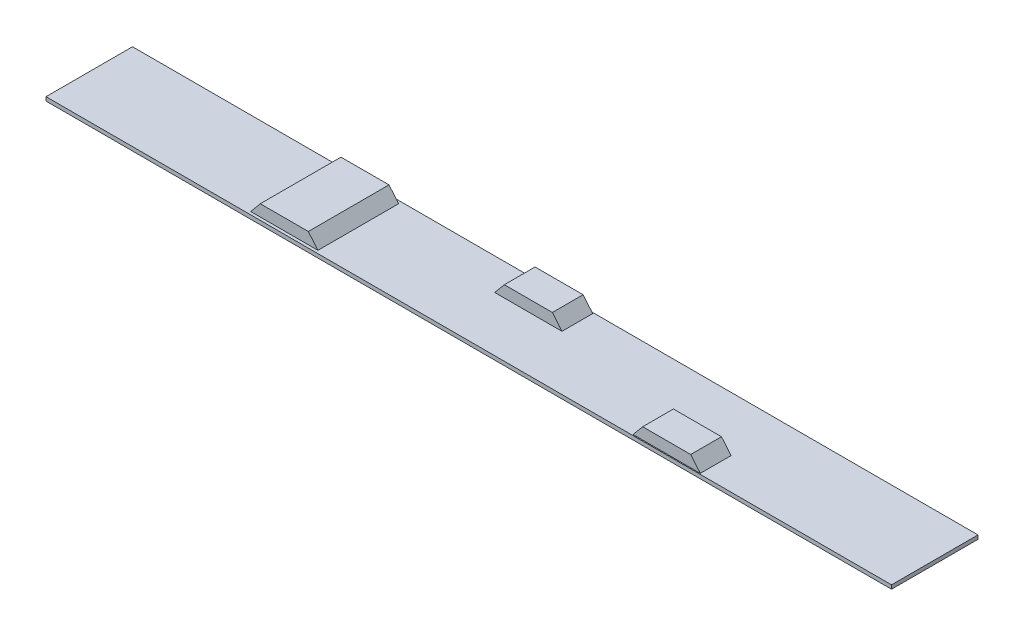
ISO-10303-21;
HEADER;
FILE_DESCRIPTION(('STEP AP214'),'2;1');
FILE_NAME('part.step','',(''),(''),'','','');
FILE_SCHEMA(('AUTOMOTIVE_DESIGN { 1 0 10303 214 1 1 1 1 }'));
ENDSEC;
DATA;
#1=APPLICATION_CONTEXT('core data for automotive mechanical design processes');
#2=APPLICATION_PROTOCOL_DEFINITION('international standard','automotive_design',2000,#1);
#3=PRODUCT_CONTEXT('',#1,'mechanical');
#4=PRODUCT('Part','Part','',(#3));
#5=PRODUCT_RELATED_PRODUCT_CATEGORY('part','',(#4));
#6=PRODUCT_DEFINITION_FORMATION('','',#4);
#7=PRODUCT_DEFINITION_CONTEXT('part definition',#1,'design');
#8=PRODUCT_DEFINITION('design','',#6,#7);
#9=PRODUCT_DEFINITION_SHAPE('','',#8);
#10=(LENGTH_UNIT() NAMED_UNIT(*) SI_UNIT(.MILLI.,.METRE.));
#11=(NAMED_UNIT(*) PLANE_ANGLE_UNIT() SI_UNIT($,.RADIAN.));
#12=(NAMED_UNIT(*) SI_UNIT($,.STERADIAN.) SOLID_ANGLE_UNIT());
#13=UNCERTAINTY_MEASURE_WITH_UNIT(LENGTH_MEASURE(1.E-05),#10,'distance_accuracy_value','');
#14=(GEOMETRIC_REPRESENTATION_CONTEXT(3) GLOBAL_UNCERTAINTY_ASSIGNED_CONTEXT((#13)) GLOBAL_UNIT_ASSIGNED_CONTEXT((#10,
#11,#12)) REPRESENTATION_CONTEXT('',''));
#15=CARTESIAN_POINT('',(0.,0.,0.));
#16=DIRECTION('',(0.,0.,1.));
#17=DIRECTION('',(1.,0.,0.));
#18=AXIS2_PLACEMENT_3D('',#15,#16,#17);
#19=CARTESIAN_POINT('',(0.,10.,0.));
#20=DIRECTION('',(0.,1.,0.));
#21=DIRECTION('',(0.,0.,1.));
#22=AXIS2_PLACEMENT_3D('',#19,#20,#21);
#23=PLANE('',#22);
#24=DIRECTION('',(1.,0.,0.));
#25=VECTOR('',#24,1.);
#26=CARTESIAN_POINT('',(-575.,9.99999999999302,105.));
#27=LINE('',#26,#25);
#28=CARTESIAN_POINT('',(-575.,9.99999999999302,105.));
#29=VERTEX_POINT('',#28);
#30=CARTESIAN_POINT('',(-400.,9.99999999999302,105.));
#31=VERTEX_POINT('',#30);
#32=EDGE_CURVE('E176',#29,#31,#27,.T.);
#33=ORIENTED_EDGE('',*,*,#32,.F.);
#34=DIRECTION('',(0.,0.,-1.));
#35=VECTOR('',#34,1.);
#36=CARTESIAN_POINT('',(-575.,9.99999999999302,105.));
#37=LINE('',#36,#35);
#38=CARTESIAN_POINT('',(-575.,9.99999999999302,-105.));
#39=VERTEX_POINT('',#38);
#40=EDGE_CURVE('E189',#29,#39,#37,.T.);
#41=ORIENTED_EDGE('',*,*,#40,.T.);
#42=DIRECTION('',(1.,0.,0.));
#43=VECTOR('',#42,1.);
#44=CARTESIAN_POINT('',(-575.,9.99999999999302,-105.));
#45=LINE('',#44,#43);
#46=CARTESIAN_POINT('',(-400.,10.,-105.));
#47=VERTEX_POINT('',#46);
#48=EDGE_CURVE('E180',#39,#47,#45,.T.);
#49=ORIENTED_EDGE('',*,*,#48,.T.);
#50=DIRECTION('',(0.,0.,-1.));
#51=VECTOR('',#50,1.);
#52=CARTESIAN_POINT('',(-400.,9.99999999999302,105.));
#53=LINE('',#52,#51);
#54=EDGE_CURVE('E572',#31,#47,#53,.T.);
#55=ORIENTED_EDGE('',*,*,#54,.F.);
#56=EDGE_LOOP('',(#33,#41,#49,#55));
#57=FACE_BOUND('',#56,.T.);
#58=DIRECTION('',(1.,0.,0.));
#59=VECTOR('',#58,1.);
#60=CARTESIAN_POINT('',(-74.9999999999997,9.99999999999651,-110.));
#61=LINE('',#60,#59);
#62=CARTESIAN_POINT('',(-74.9999999999997,9.99999999999651,-110.));
#63=VERTEX_POINT('',#62);
#64=CARTESIAN_POINT('',(100.,9.99999999999651,-110.));
#65=VERTEX_POINT('',#64);
#66=EDGE_CURVE('E197',#63,#65,#61,.T.);
#67=ORIENTED_EDGE('',*,*,#66,.T.);
#68=DIRECTION('',(0.,0.,1.));
#69=VECTOR('',#68,1.);
#70=CARTESIAN_POINT('',(100.,9.99999999999651,-110.));
#71=LINE('',#70,#69);
#72=CARTESIAN_POINT('',(100.,9.99999999999651,-30.));
#73=VERTEX_POINT('',#72);
#74=EDGE_CURVE('E226',#65,#73,#71,.T.);
#75=ORIENTED_EDGE('',*,*,#74,.T.);
#76=DIRECTION('',(1.,0.,0.));
#77=VECTOR('',#76,1.);
#78=CARTESIAN_POINT('',(-74.9999999999997,9.99999999999651,-30.));
#79=LINE('',#78,#77);
#80=CARTESIAN_POINT('',(-74.9999999999997,10.,-30.));
#81=VERTEX_POINT('',#80);
#82=EDGE_CURVE('E187',#81,#73,#79,.T.);
#83=ORIENTED_EDGE('',*,*,#82,.F.);
#84=DIRECTION('',(0.,0.,1.));
#85=VECTOR('',#84,1.);
#86=CARTESIAN_POINT('',(-74.9999999999997,9.99999999999651,-110.));
#87=LINE('',#86,#85);
#88=EDGE_CURVE('E209',#63,#81,#87,.T.);
#89=ORIENTED_EDGE('',*,*,#88,.F.);
#90=EDGE_LOOP('',(#67,#75,#83,#89));
#91=FACE_BOUND('',#90,.T.);
#92=DIRECTION('',(0.,0.,-1.));
#93=VECTOR('',#92,1.);
#94=CARTESIAN_POINT('',(1100.,10.,-112.5));
#95=LINE('',#94,#93);
#96=CARTESIAN_POINT('',(1100.,10.,112.5));
#97=VERTEX_POINT('',#96);
#98=CARTESIAN_POINT('',(1100.,10.,-112.5));
#99=VERTEX_POINT('',#98);
#100=EDGE_CURVE('E274',#97,#99,#95,.T.);
#101=ORIENTED_EDGE('',*,*,#100,.T.);
#102=DIRECTION('',(-1.,0.,0.));
#103=VECTOR('',#102,1.);
#104=CARTESIAN_POINT('',(-1100.,10.,-112.5));
#105=LINE('',#104,#103);
#106=CARTESIAN_POINT('',(-1100.,10.,-112.5));
#107=VERTEX_POINT('',#106);
#108=EDGE_CURVE('E278',#99,#107,#105,.T.);
#109=ORIENTED_EDGE('',*,*,#108,.T.);
#110=DIRECTION('',(0.,0.,1.));
#111=VECTOR('',#110,1.);
#112=CARTESIAN_POINT('',(-1100.,10.,-112.5));
#113=LINE('',#112,#111);
#114=CARTESIAN_POINT('',(-1100.,10.,112.5));
#115=VERTEX_POINT('',#114);
#116=EDGE_CURVE('E282',#107,#115,#113,.T.);
#117=ORIENTED_EDGE('',*,*,#116,.T.);
#118=DIRECTION('',(1.,0.,0.));
#119=VECTOR('',#118,1.);
#120=CARTESIAN_POINT('',(-1100.,10.,112.5));
#121=LINE('',#120,#119);
#122=EDGE_CURVE('E285',#115,#97,#121,.T.);
#123=ORIENTED_EDGE('',*,*,#122,.T.);
#124=EDGE_LOOP('',(#101,#109,#117,#123));
#125=FACE_BOUND('',#124,.T.);
#126=DIRECTION('',(0.,0.,-1.));
#127=VECTOR('',#126,1.);
#128=CARTESIAN_POINT('',(600.,10.,110.));
#129=LINE('',#128,#127);
#130=CARTESIAN_POINT('',(600.,10.,110.));
#131=VERTEX_POINT('',#130);
#132=CARTESIAN_POINT('',(600.,10.,30.));
#133=VERTEX_POINT('',#132);
#134=EDGE_CURVE('E269',#131,#133,#129,.T.);
#135=ORIENTED_EDGE('',*,*,#134,.F.);
#136=DIRECTION('',(1.,0.,0.));
#137=VECTOR('',#136,1.);
#138=CARTESIAN_POINT('',(425.,10.,110.));
#139=LINE('',#138,#137);
#140=CARTESIAN_POINT('',(425.,10.,110.));
#141=VERTEX_POINT('',#140);
#142=EDGE_CURVE('E232',#141,#131,#139,.T.);
#143=ORIENTED_EDGE('',*,*,#142,.F.);
#144=DIRECTION('',(0.,0.,-1.));
#145=VECTOR('',#144,1.);
#146=CARTESIAN_POINT('',(425.,10.,110.));
#147=LINE('',#146,#145);
#148=CARTESIAN_POINT('',(425.,10.,30.));
#149=VERTEX_POINT('',#148);
#150=EDGE_CURVE('E247',#141,#149,#147,.T.);
#151=ORIENTED_EDGE('',*,*,#150,.T.);
#152=DIRECTION('',(1.,0.,0.));
#153=VECTOR('',#152,1.);
#154=CARTESIAN_POINT('',(425.,10.,30.));
#155=LINE('',#154,#153);
#156=EDGE_CURVE('E222',#149,#133,#155,.T.);
#157=ORIENTED_EDGE('',*,*,#156,.T.);
#158=EDGE_LOOP('',(#135,#143,#151,#157));
#159=FACE_BOUND('',#158,.T.);
#160=ADVANCED_FACE('F43',(#57,#91,#125,#159),#23,.T.);
#161=CARTESIAN_POINT('',(1100.,10.,-112.5));
#162=DIRECTION('',(-1.,0.,0.));
#163=DIRECTION('',(0.,0.,1.));
#164=AXIS2_PLACEMENT_3D('',#161,#162,#163);
#165=PLANE('',#164);
#166=DIRECTION('',(0.,0.,-1.));
#167=VECTOR('',#166,1.);
#168=CARTESIAN_POINT('',(1100.,0.,-112.5));
#169=LINE('',#168,#167);
#170=CARTESIAN_POINT('',(1100.,0.,112.5));
#171=VERTEX_POINT('',#170);
#172=CARTESIAN_POINT('',(1100.,0.,-112.5));
#173=VERTEX_POINT('',#172);
#174=EDGE_CURVE('E273',#171,#173,#169,.T.);
#175=ORIENTED_EDGE('',*,*,#174,.T.);
#176=DIRECTION('',(0.,-1.,0.));
#177=VECTOR('',#176,1.);
#178=CARTESIAN_POINT('',(1100.,10.,-112.5));
#179=LINE('',#178,#177);
#180=EDGE_CURVE('E11',#99,#173,#179,.T.);
#181=ORIENTED_EDGE('',*,*,#180,.F.);
#182=ORIENTED_EDGE('',*,*,#100,.F.);
#183=DIRECTION('',(0.,-1.,0.));
#184=VECTOR('',#183,1.);
#185=CARTESIAN_POINT('',(1100.,10.,112.5));
#186=LINE('',#185,#184);
#187=EDGE_CURVE('E288',#97,#171,#186,.T.);
#188=ORIENTED_EDGE('',*,*,#187,.T.);
#189=EDGE_LOOP('',(#175,#181,#182,#188));
#190=FACE_BOUND('',#189,.T.);
#191=ADVANCED_FACE('F45',(#190),#165,.F.);
#192=CARTESIAN_POINT('',(-1100.,10.,-112.5));
#193=DIRECTION('',(0.,0.,1.));
#194=DIRECTION('',(1.,0.,0.));
#195=AXIS2_PLACEMENT_3D('',#192,#193,#194);
#196=PLANE('',#195);
#197=DIRECTION('',(-1.,0.,0.));
#198=VECTOR('',#197,1.);
#199=CARTESIAN_POINT('',(-1100.,0.,-112.5));
#200=LINE('',#199,#198);
#201=CARTESIAN_POINT('',(-1100.,0.,-112.5));
#202=VERTEX_POINT('',#201);
#203=EDGE_CURVE('E292',#173,#202,#200,.T.);
#204=ORIENTED_EDGE('',*,*,#203,.T.);
#205=DIRECTION('',(0.,-1.,0.));
#206=VECTOR('',#205,1.);
#207=CARTESIAN_POINT('',(-1100.,10.,-112.5));
#208=LINE('',#207,#206);
#209=EDGE_CURVE('E52',#107,#202,#208,.T.);
#210=ORIENTED_EDGE('',*,*,#209,.F.);
#211=ORIENTED_EDGE('',*,*,#108,.F.);
#212=ORIENTED_EDGE('',*,*,#180,.T.);
#213=EDGE_LOOP('',(#204,#210,#211,#212));
#214=FACE_BOUND('',#213,.T.);
#215=ADVANCED_FACE('F328',(#214),#196,.F.);
#216=CARTESIAN_POINT('',(-1100.,10.,-112.5));
#217=DIRECTION('',(1.,0.,0.));
#218=DIRECTION('',(0.,0.,-1.));
#219=AXIS2_PLACEMENT_3D('',#216,#217,#218);
#220=PLANE('',#219);
#221=DIRECTION('',(0.,0.,1.));
#222=VECTOR('',#221,1.);
#223=CARTESIAN_POINT('',(-1100.,0.,-112.5));
#224=LINE('',#223,#222);
#225=CARTESIAN_POINT('',(-1100.,0.,112.5));
#226=VERTEX_POINT('',#225);
#227=EDGE_CURVE('E295',#202,#226,#224,.T.);
#228=ORIENTED_EDGE('',*,*,#227,.T.);
#229=DIRECTION('',(0.,-1.,0.));
#230=VECTOR('',#229,1.);
#231=CARTESIAN_POINT('',(-1100.,10.,112.5));
#232=LINE('',#231,#230);
#233=EDGE_CURVE('E303',#115,#226,#232,.T.);
#234=ORIENTED_EDGE('',*,*,#233,.F.);
#235=ORIENTED_EDGE('',*,*,#116,.F.);
#236=ORIENTED_EDGE('',*,*,#209,.T.);
#237=EDGE_LOOP('',(#228,#234,#235,#236));
#238=FACE_BOUND('',#237,.T.);
#239=ADVANCED_FACE('F312',(#238),#220,.F.);
#240=CARTESIAN_POINT('',(-1100.,10.,112.5));
#241=DIRECTION('',(0.,0.,-1.));
#242=DIRECTION('',(-1.,0.,0.));
#243=AXIS2_PLACEMENT_3D('',#240,#241,#242);
#244=PLANE('',#243);
#245=DIRECTION('',(1.,0.,0.));
#246=VECTOR('',#245,1.);
#247=CARTESIAN_POINT('',(-1100.,0.,112.5));
#248=LINE('',#247,#246);
#249=EDGE_CURVE('E279',#226,#171,#248,.T.);
#250=ORIENTED_EDGE('',*,*,#249,.T.);
#251=ORIENTED_EDGE('',*,*,#187,.F.);
#252=ORIENTED_EDGE('',*,*,#122,.F.);
#253=ORIENTED_EDGE('',*,*,#233,.T.);
#254=EDGE_LOOP('',(#250,#251,#252,#253));
#255=FACE_BOUND('',#254,.T.);
#256=ADVANCED_FACE('F321',(#255),#244,.F.);
#257=CARTESIAN_POINT('',(0.,0.,0.));
#258=DIRECTION('',(0.,1.,0.));
#259=DIRECTION('',(0.,0.,1.));
#260=AXIS2_PLACEMENT_3D('',#257,#258,#259);
#261=PLANE('',#260);
#262=ORIENTED_EDGE('',*,*,#174,.F.);
#263=ORIENTED_EDGE('',*,*,#249,.F.);
#264=ORIENTED_EDGE('',*,*,#227,.F.);
#265=ORIENTED_EDGE('',*,*,#203,.F.);
#266=EDGE_LOOP('',(#262,#263,#264,#265));
#267=FACE_BOUND('',#266,.T.);
#268=ADVANCED_FACE('F318',(#267),#261,.F.);
#269=CARTESIAN_POINT('',(575.,40.,110.));
#270=DIRECTION('',(-0.768221279597376,-0.64018439966448,0.));
#271=DIRECTION('',(0.64018439966448,-0.768221279597376,0.));
#272=AXIS2_PLACEMENT_3D('',#269,#270,#271);
#273=PLANE('',#272);
#274=DIRECTION('',(-0.64018439966448,0.768221279597375,0.));
#275=VECTOR('',#274,1.);
#276=CARTESIAN_POINT('',(575.,40.,30.));
#277=LINE('',#276,#275);
#278=CARTESIAN_POINT('',(575.,40.,30.));
#279=VERTEX_POINT('',#278);
#280=EDGE_CURVE('E250',#133,#279,#277,.T.);
#281=ORIENTED_EDGE('',*,*,#280,.T.);
#282=DIRECTION('',(0.,0.,-1.));
#283=VECTOR('',#282,1.);
#284=CARTESIAN_POINT('',(575.,40.,110.));
#285=LINE('',#284,#283);
#286=CARTESIAN_POINT('',(575.,40.,110.));
#287=VERTEX_POINT('',#286);
#288=EDGE_CURVE('E265',#287,#279,#285,.T.);
#289=ORIENTED_EDGE('',*,*,#288,.F.);
#290=DIRECTION('',(-0.64018439966448,0.768221279597375,0.));
#291=VECTOR('',#290,1.);
#292=CARTESIAN_POINT('',(575.,40.,110.));
#293=LINE('',#292,#291);
#294=EDGE_CURVE('E236',#131,#287,#293,.T.);
#295=ORIENTED_EDGE('',*,*,#294,.F.);
#296=ORIENTED_EDGE('',*,*,#134,.T.);
#297=EDGE_LOOP('',(#281,#289,#295,#296));
#298=FACE_BOUND('',#297,.T.);
#299=ADVANCED_FACE('F343',(#298),#273,.F.);
#300=CARTESIAN_POINT('',(450.,40.,110.));
#301=DIRECTION('',(0.,-1.,0.));
#302=DIRECTION('',(0.,0.,-1.));
#303=AXIS2_PLACEMENT_3D('',#300,#301,#302);
#304=PLANE('',#303);
#305=DIRECTION('',(-1.,0.,0.));
#306=VECTOR('',#305,1.);
#307=CARTESIAN_POINT('',(450.,40.,30.));
#308=LINE('',#307,#306);
#309=CARTESIAN_POINT('',(450.,40.,30.));
#310=VERTEX_POINT('',#309);
#311=EDGE_CURVE('E253',#279,#310,#308,.T.);
#312=ORIENTED_EDGE('',*,*,#311,.T.);
#313=DIRECTION('',(0.,0.,-1.));
#314=VECTOR('',#313,1.);
#315=CARTESIAN_POINT('',(450.,40.,110.));
#316=LINE('',#315,#314);
#317=CARTESIAN_POINT('',(450.,40.,110.));
#318=VERTEX_POINT('',#317);
#319=EDGE_CURVE('E261',#318,#310,#316,.T.);
#320=ORIENTED_EDGE('',*,*,#319,.F.);
#321=DIRECTION('',(-1.,0.,0.));
#322=VECTOR('',#321,1.);
#323=CARTESIAN_POINT('',(450.,40.,110.));
#324=LINE('',#323,#322);
#325=EDGE_CURVE('E240',#287,#318,#324,.T.);
#326=ORIENTED_EDGE('',*,*,#325,.F.);
#327=ORIENTED_EDGE('',*,*,#288,.T.);
#328=EDGE_LOOP('',(#312,#320,#326,#327));
#329=FACE_BOUND('',#328,.T.);
#330=ADVANCED_FACE('F362',(#329),#304,.F.);
#331=CARTESIAN_POINT('',(425.,10.,110.));
#332=DIRECTION('',(0.768221279597376,-0.64018439966448,0.));
#333=DIRECTION('',(0.64018439966448,0.768221279597376,0.));
#334=AXIS2_PLACEMENT_3D('',#331,#332,#333);
#335=PLANE('',#334);
#336=DIRECTION('',(-0.64018439966448,-0.768221279597375,0.));
#337=VECTOR('',#336,1.);
#338=CARTESIAN_POINT('',(425.,10.,30.));
#339=LINE('',#338,#337);
#340=EDGE_CURVE('E237',#310,#149,#339,.T.);
#341=ORIENTED_EDGE('',*,*,#340,.T.);
#342=ORIENTED_EDGE('',*,*,#150,.F.);
#343=DIRECTION('',(-0.64018439966448,-0.768221279597375,0.));
#344=VECTOR('',#343,1.);
#345=CARTESIAN_POINT('',(425.,10.,110.));
#346=LINE('',#345,#344);
#347=EDGE_CURVE('E243',#318,#141,#346,.T.);
#348=ORIENTED_EDGE('',*,*,#347,.F.);
#349=ORIENTED_EDGE('',*,*,#319,.T.);
#350=EDGE_LOOP('',(#341,#342,#348,#349));
#351=FACE_BOUND('',#350,.T.);
#352=ADVANCED_FACE('F369',(#351),#335,.F.);
#353=CARTESIAN_POINT('',(0.,0.,110.));
#354=DIRECTION('',(0.,0.,-1.));
#355=DIRECTION('',(-1.,0.,0.));
#356=AXIS2_PLACEMENT_3D('',#353,#354,#355);
#357=PLANE('',#356);
#358=ORIENTED_EDGE('',*,*,#142,.T.);
#359=ORIENTED_EDGE('',*,*,#294,.T.);
#360=ORIENTED_EDGE('',*,*,#325,.T.);
#361=ORIENTED_EDGE('',*,*,#347,.T.);
#362=EDGE_LOOP('',(#358,#359,#360,#361));
#363=FACE_BOUND('',#362,.T.);
#364=ADVANCED_FACE('F376',(#363),#357,.F.);
#365=CARTESIAN_POINT('',(0.,0.,30.));
#366=DIRECTION('',(0.,0.,-1.));
#367=DIRECTION('',(-1.,0.,0.));
#368=AXIS2_PLACEMENT_3D('',#365,#366,#367);
#369=PLANE('',#368);
#370=ORIENTED_EDGE('',*,*,#156,.F.);
#371=ORIENTED_EDGE('',*,*,#340,.F.);
#372=ORIENTED_EDGE('',*,*,#311,.F.);
#373=ORIENTED_EDGE('',*,*,#280,.F.);
#374=EDGE_LOOP('',(#370,#371,#372,#373));
#375=FACE_BOUND('',#374,.T.);
#376=ADVANCED_FACE('F384',(#375),#369,.T.);
#377=CARTESIAN_POINT('',(-49.9999999999997,39.9999999999965,-110.));
#378=DIRECTION('',(-0.768221279597376,0.64018439966448,0.));
#379=DIRECTION('',(-0.64018439966448,-0.768221279597376,0.));
#380=AXIS2_PLACEMENT_3D('',#377,#378,#379);
#381=PLANE('',#380);
#382=DIRECTION('',(-0.64018439966448,-0.768221279597376,0.));
#383=VECTOR('',#382,1.);
#384=CARTESIAN_POINT('',(-49.9999999999997,39.9999999999965,-30.));
#385=LINE('',#384,#383);
#386=CARTESIAN_POINT('',(-49.9999999999997,39.9999999999965,-30.));
#387=VERTEX_POINT('',#386);
#388=EDGE_CURVE('E67',#387,#81,#385,.T.);
#389=ORIENTED_EDGE('',*,*,#388,.F.);
#390=DIRECTION('',(0.,0.,1.));
#391=VECTOR('',#390,1.);
#392=CARTESIAN_POINT('',(-49.9999999999997,39.9999999999965,-110.));
#393=LINE('',#392,#391);
#394=CARTESIAN_POINT('',(-49.9999999999997,39.9999999999965,-110.));
#395=VERTEX_POINT('',#394);
#396=EDGE_CURVE('E219',#395,#387,#393,.T.);
#397=ORIENTED_EDGE('',*,*,#396,.F.);
#398=DIRECTION('',(-0.64018439966448,-0.768221279597376,0.));
#399=VECTOR('',#398,1.);
#400=CARTESIAN_POINT('',(-49.9999999999997,39.9999999999965,-110.));
#401=LINE('',#400,#399);
#402=EDGE_CURVE('E193',#395,#63,#401,.T.);
#403=ORIENTED_EDGE('',*,*,#402,.T.);
#404=ORIENTED_EDGE('',*,*,#88,.T.);
#405=EDGE_LOOP('',(#389,#397,#403,#404));
#406=FACE_BOUND('',#405,.T.);
#407=ADVANCED_FACE('F392',(#406),#381,.T.);
#408=CARTESIAN_POINT('',(75.0000000000003,39.9999999999965,-110.));
#409=DIRECTION('',(0.,1.,0.));
#410=DIRECTION('',(0.,0.,1.));
#411=AXIS2_PLACEMENT_3D('',#408,#409,#410);
#412=PLANE('',#411);
#413=DIRECTION('',(-1.,0.,0.));
#414=VECTOR('',#413,1.);
#415=CARTESIAN_POINT('',(75.0000000000003,39.9999999999965,-30.));
#416=LINE('',#415,#414);
#417=CARTESIAN_POINT('',(75.0000000000003,39.9999999999965,-30.));
#418=VERTEX_POINT('',#417);
#419=EDGE_CURVE('E198',#418,#387,#416,.T.);
#420=ORIENTED_EDGE('',*,*,#419,.F.);
#421=DIRECTION('',(0.,0.,1.));
#422=VECTOR('',#421,1.);
#423=CARTESIAN_POINT('',(75.0000000000003,39.9999999999965,-110.));
#424=LINE('',#423,#422);
#425=CARTESIAN_POINT('',(75.0000000000003,39.9999999999965,-110.));
#426=VERTEX_POINT('',#425);
#427=EDGE_CURVE('E223',#426,#418,#424,.T.);
#428=ORIENTED_EDGE('',*,*,#427,.F.);
#429=DIRECTION('',(-1.,0.,0.));
#430=VECTOR('',#429,1.);
#431=CARTESIAN_POINT('',(75.0000000000003,39.9999999999965,-110.));
#432=LINE('',#431,#430);
#433=EDGE_CURVE('E206',#426,#395,#432,.T.);
#434=ORIENTED_EDGE('',*,*,#433,.T.);
#435=ORIENTED_EDGE('',*,*,#396,.T.);
#436=EDGE_LOOP('',(#420,#428,#434,#435));
#437=FACE_BOUND('',#436,.T.);
#438=ADVANCED_FACE('F400',(#437),#412,.T.);
#439=CARTESIAN_POINT('',(100.,9.99999999999651,-110.));
#440=DIRECTION('',(0.768221279597376,0.64018439966448,0.));
#441=DIRECTION('',(-0.64018439966448,0.768221279597376,0.));
#442=AXIS2_PLACEMENT_3D('',#439,#440,#441);
#443=PLANE('',#442);
#444=DIRECTION('',(-0.64018439966448,0.768221279597376,0.));
#445=VECTOR('',#444,1.);
#446=CARTESIAN_POINT('',(100.,9.99999999999651,-30.));
#447=LINE('',#446,#445);
#448=EDGE_CURVE('E213',#73,#418,#447,.T.);
#449=ORIENTED_EDGE('',*,*,#448,.F.);
#450=ORIENTED_EDGE('',*,*,#74,.F.);
#451=DIRECTION('',(-0.64018439966448,0.768221279597376,0.));
#452=VECTOR('',#451,1.);
#453=CARTESIAN_POINT('',(100.,9.99999999999651,-110.));
#454=LINE('',#453,#452);
#455=EDGE_CURVE('E202',#65,#426,#454,.T.);
#456=ORIENTED_EDGE('',*,*,#455,.T.);
#457=ORIENTED_EDGE('',*,*,#427,.T.);
#458=EDGE_LOOP('',(#449,#450,#456,#457));
#459=FACE_BOUND('',#458,.T.);
#460=ADVANCED_FACE('F408',(#459),#443,.T.);
#461=CARTESIAN_POINT('',(0.,0.,-110.));
#462=DIRECTION('',(0.,0.,-1.));
#463=DIRECTION('',(-1.,0.,0.));
#464=AXIS2_PLACEMENT_3D('',#461,#462,#463);
#465=PLANE('',#464);
#466=ORIENTED_EDGE('',*,*,#402,.F.);
#467=ORIENTED_EDGE('',*,*,#433,.F.);
#468=ORIENTED_EDGE('',*,*,#455,.F.);
#469=ORIENTED_EDGE('',*,*,#66,.F.);
#470=EDGE_LOOP('',(#466,#467,#468,#469));
#471=FACE_BOUND('',#470,.T.);
#472=ADVANCED_FACE('F416',(#471),#465,.T.);
#473=CARTESIAN_POINT('',(0.,0.,-30.));
#474=DIRECTION('',(0.,0.,-1.));
#475=DIRECTION('',(-1.,0.,0.));
#476=AXIS2_PLACEMENT_3D('',#473,#474,#475);
#477=PLANE('',#476);
#478=ORIENTED_EDGE('',*,*,#388,.T.);
#479=ORIENTED_EDGE('',*,*,#82,.T.);
#480=ORIENTED_EDGE('',*,*,#448,.T.);
#481=ORIENTED_EDGE('',*,*,#419,.T.);
#482=EDGE_LOOP('',(#478,#479,#480,#481));
#483=FACE_BOUND('',#482,.T.);
#484=ADVANCED_FACE('F424',(#483),#477,.F.);
#485=CARTESIAN_POINT('',(-400.,9.99999999999302,105.));
#486=DIRECTION('',(-0.768221279597376,-0.64018439966448,0.));
#487=DIRECTION('',(0.64018439966448,-0.768221279597376,0.));
#488=AXIS2_PLACEMENT_3D('',#485,#486,#487);
#489=PLANE('',#488);
#490=DIRECTION('',(-0.64018439966448,0.768221279597376,0.));
#491=VECTOR('',#490,1.);
#492=CARTESIAN_POINT('',(-400.,9.99999999999302,-105.));
#493=LINE('',#492,#491);
#494=CARTESIAN_POINT('',(-425.,39.999999999993,-105.));
#495=VERTEX_POINT('',#494);
#496=EDGE_CURVE('E59',#47,#495,#493,.T.);
#497=ORIENTED_EDGE('',*,*,#496,.T.);
#498=DIRECTION('',(0.,0.,-1.));
#499=VECTOR('',#498,1.);
#500=CARTESIAN_POINT('',(-425.,39.999999999993,105.));
#501=LINE('',#500,#499);
#502=CARTESIAN_POINT('',(-425.,39.999999999993,105.));
#503=VERTEX_POINT('',#502);
#504=EDGE_CURVE('E164',#503,#495,#501,.T.);
#505=ORIENTED_EDGE('',*,*,#504,.F.);
#506=DIRECTION('',(-0.64018439966448,0.768221279597376,0.));
#507=VECTOR('',#506,1.);
#508=CARTESIAN_POINT('',(-400.,9.99999999999302,105.));
#509=LINE('',#508,#507);
#510=EDGE_CURVE('E171',#31,#503,#509,.T.);
#511=ORIENTED_EDGE('',*,*,#510,.F.);
#512=ORIENTED_EDGE('',*,*,#54,.T.);
#513=EDGE_LOOP('',(#497,#505,#511,#512));
#514=FACE_BOUND('',#513,.T.);
#515=ADVANCED_FACE('F182',(#514),#489,.F.);
#516=CARTESIAN_POINT('',(-425.,39.999999999993,105.));
#517=DIRECTION('',(0.,-1.,0.));
#518=DIRECTION('',(0.,0.,-1.));
#519=AXIS2_PLACEMENT_3D('',#516,#517,#518);
#520=PLANE('',#519);
#521=DIRECTION('',(-1.,0.,0.));
#522=VECTOR('',#521,1.);
#523=CARTESIAN_POINT('',(-425.,39.999999999993,-105.));
#524=LINE('',#523,#522);
#525=CARTESIAN_POINT('',(-550.,39.999999999993,-105.));
#526=VERTEX_POINT('',#525);
#527=EDGE_CURVE('E566',#495,#526,#524,.T.);
#528=ORIENTED_EDGE('',*,*,#527,.T.);
#529=DIRECTION('',(0.,0.,-1.));
#530=VECTOR('',#529,1.);
#531=CARTESIAN_POINT('',(-550.,39.999999999993,105.));
#532=LINE('',#531,#530);
#533=CARTESIAN_POINT('',(-550.,39.999999999993,105.));
#534=VERTEX_POINT('',#533);
#535=EDGE_CURVE('E166',#534,#526,#532,.T.);
#536=ORIENTED_EDGE('',*,*,#535,.F.);
#537=DIRECTION('',(-1.,0.,0.));
#538=VECTOR('',#537,1.);
#539=CARTESIAN_POINT('',(-425.,39.999999999993,105.));
#540=LINE('',#539,#538);
#541=EDGE_CURVE('E160',#503,#534,#540,.T.);
#542=ORIENTED_EDGE('',*,*,#541,.F.);
#543=ORIENTED_EDGE('',*,*,#504,.T.);
#544=EDGE_LOOP('',(#528,#536,#542,#543));
#545=FACE_BOUND('',#544,.T.);
#546=ADVANCED_FACE('F162',(#545),#520,.F.);
#547=CARTESIAN_POINT('',(-550.,39.999999999993,105.));
#548=DIRECTION('',(0.768221279597376,-0.64018439966448,0.));
#549=DIRECTION('',(0.64018439966448,0.768221279597376,0.));
#550=AXIS2_PLACEMENT_3D('',#547,#548,#549);
#551=PLANE('',#550);
#552=DIRECTION('',(-0.64018439966448,-0.768221279597376,0.));
#553=VECTOR('',#552,1.);
#554=CARTESIAN_POINT('',(-550.,39.999999999993,-105.));
#555=LINE('',#554,#553);
#556=EDGE_CURVE('E563',#526,#39,#555,.T.);
#557=ORIENTED_EDGE('',*,*,#556,.T.);
#558=ORIENTED_EDGE('',*,*,#40,.F.);
#559=DIRECTION('',(-0.64018439966448,-0.768221279597376,0.));
#560=VECTOR('',#559,1.);
#561=CARTESIAN_POINT('',(-550.,39.999999999993,105.));
#562=LINE('',#561,#560);
#563=EDGE_CURVE('E170',#534,#29,#562,.T.);
#564=ORIENTED_EDGE('',*,*,#563,.F.);
#565=ORIENTED_EDGE('',*,*,#535,.T.);
#566=EDGE_LOOP('',(#557,#558,#564,#565));
#567=FACE_BOUND('',#566,.T.);
#568=ADVANCED_FACE('F444',(#567),#551,.F.);
#569=CARTESIAN_POINT('',(0.,0.,105.));
#570=DIRECTION('',(0.,0.,1.));
#571=DIRECTION('',(1.,0.,0.));
#572=AXIS2_PLACEMENT_3D('',#569,#570,#571);
#573=PLANE('',#572);
#574=ORIENTED_EDGE('',*,*,#510,.T.);
#575=ORIENTED_EDGE('',*,*,#541,.T.);
#576=ORIENTED_EDGE('',*,*,#563,.T.);
#577=ORIENTED_EDGE('',*,*,#32,.T.);
#578=EDGE_LOOP('',(#574,#575,#576,#577));
#579=FACE_BOUND('',#578,.T.);
#580=ADVANCED_FACE('F174',(#579),#573,.T.);
#581=CARTESIAN_POINT('',(0.,0.,-105.));
#582=DIRECTION('',(0.,0.,1.));
#583=DIRECTION('',(1.,0.,0.));
#584=AXIS2_PLACEMENT_3D('',#581,#582,#583);
#585=PLANE('',#584);
#586=ORIENTED_EDGE('',*,*,#496,.F.);
#587=ORIENTED_EDGE('',*,*,#48,.F.);
#588=ORIENTED_EDGE('',*,*,#556,.F.);
#589=ORIENTED_EDGE('',*,*,#527,.F.);
#590=EDGE_LOOP('',(#586,#587,#588,#589));
#591=FACE_BOUND('',#590,.T.);
#592=ADVANCED_FACE('F458',(#591),#585,.F.);
#593=CLOSED_SHELL('',(#160,#191,#215,#239,#256,#268,#299,#330,#352,#364,#376,#407,#438,#460,
#472,#484,#515,#546,#568,#580,#592));
#594=MANIFOLD_SOLID_BREP('B2',#593);
#595=ADVANCED_BREP_SHAPE_REPRESENTATION('',(#18,#594),#14);
#596=SHAPE_DEFINITION_REPRESENTATION(#9,#595);
ENDSEC;
END-ISO-10303-21;
